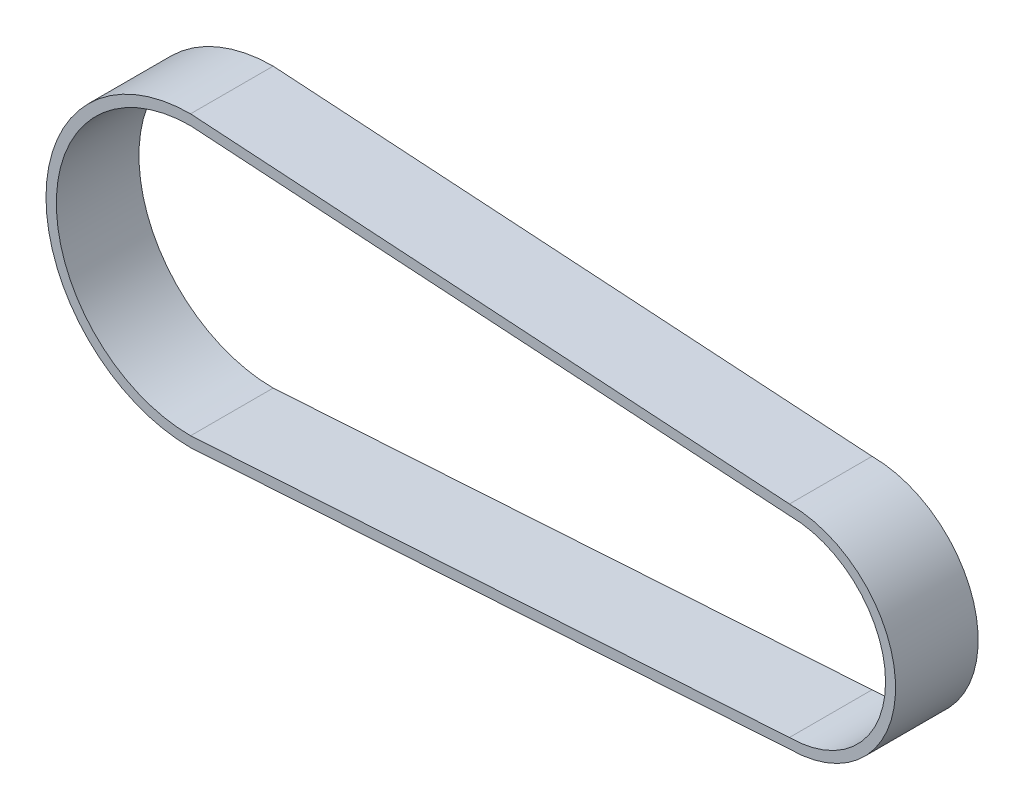
ISO-10303-21;
HEADER;
FILE_DESCRIPTION(('STEP AP214'),'2;1');
FILE_NAME('part.step','',(''),(''),'','','');
FILE_SCHEMA(('AUTOMOTIVE_DESIGN { 1 0 10303 214 1 1 1 1 }'));
ENDSEC;
DATA;
#1=APPLICATION_CONTEXT('core data for automotive mechanical design processes');
#2=APPLICATION_PROTOCOL_DEFINITION('international standard','automotive_design',2000,#1);
#3=PRODUCT_CONTEXT('',#1,'mechanical');
#4=PRODUCT('Part','Part','',(#3));
#5=PRODUCT_RELATED_PRODUCT_CATEGORY('part','',(#4));
#6=PRODUCT_DEFINITION_FORMATION('','',#4);
#7=PRODUCT_DEFINITION_CONTEXT('part definition',#1,'design');
#8=PRODUCT_DEFINITION('design','',#6,#7);
#9=PRODUCT_DEFINITION_SHAPE('','',#8);
#10=(LENGTH_UNIT() NAMED_UNIT(*) SI_UNIT(.MILLI.,.METRE.));
#11=(NAMED_UNIT(*) PLANE_ANGLE_UNIT() SI_UNIT($,.RADIAN.));
#12=(NAMED_UNIT(*) SI_UNIT($,.STERADIAN.) SOLID_ANGLE_UNIT());
#13=UNCERTAINTY_MEASURE_WITH_UNIT(LENGTH_MEASURE(1.E-05),#10,'distance_accuracy_value','');
#14=(GEOMETRIC_REPRESENTATION_CONTEXT(3) GLOBAL_UNCERTAINTY_ASSIGNED_CONTEXT((#13)) GLOBAL_UNIT_ASSIGNED_CONTEXT((#10,
#11,#12)) REPRESENTATION_CONTEXT('',''));
#15=CARTESIAN_POINT('',(0.,0.,0.));
#16=DIRECTION('',(0.,0.,1.));
#17=DIRECTION('',(1.,0.,0.));
#18=AXIS2_PLACEMENT_3D('',#15,#16,#17);
#19=CARTESIAN_POINT('',(-33.,0.,8.));
#20=DIRECTION('',(0.,0.,1.));
#21=DIRECTION('',(1.,0.,0.));
#22=AXIS2_PLACEMENT_3D('',#19,#20,#21);
#23=PLANE('',#22);
#24=CARTESIAN_POINT('',(-33.,0.,8.));
#25=DIRECTION('',(0.,0.,1.));
#26=DIRECTION('',(1.,0.,0.));
#27=AXIS2_PLACEMENT_3D('',#24,#25,#26);
#28=CIRCLE('',#27,14.);
#29=CARTESIAN_POINT('',(-33.,14.,8.));
#30=VERTEX_POINT('',#29);
#31=CARTESIAN_POINT('',(-33.,-14.,8.));
#32=VERTEX_POINT('',#31);
#33=EDGE_CURVE('E138',#30,#32,#28,.T.);
#34=ORIENTED_EDGE('',*,*,#33,.T.);
#35=DIRECTION('',(0.997945166804636,0.0640737391703274,0.));
#36=VECTOR('',#35,1.);
#37=CARTESIAN_POINT('',(-33.,-14.,8.));
#38=LINE('',#37,#36);
#39=CARTESIAN_POINT('',(25.,-10.2760710753495,8.));
#40=VERTEX_POINT('',#39);
#41=EDGE_CURVE('E141',#32,#40,#38,.T.);
#42=ORIENTED_EDGE('',*,*,#41,.T.);
#43=CARTESIAN_POINT('',(25.,0.,8.));
#44=DIRECTION('',(0.,0.,1.));
#45=DIRECTION('',(1.,0.,0.));
#46=AXIS2_PLACEMENT_3D('',#43,#44,#45);
#47=CIRCLE('',#46,10.2760710753495);
#48=CARTESIAN_POINT('',(25.,10.2760710753495,8.));
#49=VERTEX_POINT('',#48);
#50=EDGE_CURVE('E144',#40,#49,#47,.T.);
#51=ORIENTED_EDGE('',*,*,#50,.T.);
#52=DIRECTION('',(-0.997945166804636,0.0640737391703274,0.));
#53=VECTOR('',#52,1.);
#54=CARTESIAN_POINT('',(25.,10.2760710753495,8.));
#55=LINE('',#54,#53);
#56=EDGE_CURVE('E146',#49,#30,#55,.T.);
#57=ORIENTED_EDGE('',*,*,#56,.T.);
#58=EDGE_LOOP('',(#34,#42,#51,#57));
#59=FACE_BOUND('',#58,.T.);
#60=DIRECTION('',(0.997977728901657,0.0635645547163693,0.));
#61=VECTOR('',#60,1.);
#62=CARTESIAN_POINT('',(-33.,-13.,8.));
#63=LINE('',#62,#61);
#64=CARTESIAN_POINT('',(-33.,-13.,8.));
#65=VERTEX_POINT('',#64);
#66=CARTESIAN_POINT('',(25.,-9.30578512247269,8.));
#67=VERTEX_POINT('',#66);
#68=EDGE_CURVE('E110',#65,#67,#63,.T.);
#69=ORIENTED_EDGE('',*,*,#68,.F.);
#70=CARTESIAN_POINT('',(-33.,0.,8.));
#71=DIRECTION('',(0.,0.,1.));
#72=DIRECTION('',(1.,0.,0.));
#73=AXIS2_PLACEMENT_3D('',#70,#71,#72);
#74=CIRCLE('',#73,13.);
#75=CARTESIAN_POINT('',(-33.,13.,8.));
#76=VERTEX_POINT('',#75);
#77=EDGE_CURVE('E102',#76,#65,#74,.T.);
#78=ORIENTED_EDGE('',*,*,#77,.F.);
#79=DIRECTION('',(-0.997977728901657,0.0635645547163693,0.));
#80=VECTOR('',#79,1.);
#81=CARTESIAN_POINT('',(25.,9.30578512247269,8.));
#82=LINE('',#81,#80);
#83=CARTESIAN_POINT('',(25.,9.30578512247269,8.));
#84=VERTEX_POINT('',#83);
#85=EDGE_CURVE('E124',#84,#76,#82,.T.);
#86=ORIENTED_EDGE('',*,*,#85,.F.);
#87=CARTESIAN_POINT('',(25.,0.,8.));
#88=DIRECTION('',(0.,0.,1.));
#89=DIRECTION('',(-1.,0.,0.));
#90=AXIS2_PLACEMENT_3D('',#87,#88,#89);
#91=CIRCLE('',#90,9.30578512247269);
#92=EDGE_CURVE('E122',#67,#84,#91,.T.);
#93=ORIENTED_EDGE('',*,*,#92,.F.);
#94=EDGE_LOOP('',(#69,#78,#86,#93));
#95=FACE_BOUND('',#94,.T.);
#96=ADVANCED_FACE('F37',(#59,#95),#23,.T.);
#97=CARTESIAN_POINT('',(-33.,0.,0.));
#98=DIRECTION('',(0.,0.,1.));
#99=DIRECTION('',(1.,0.,0.));
#100=AXIS2_PLACEMENT_3D('',#97,#98,#99);
#101=PLANE('',#100);
#102=CARTESIAN_POINT('',(-33.,0.,0.));
#103=DIRECTION('',(0.,0.,1.));
#104=DIRECTION('',(1.,0.,0.));
#105=AXIS2_PLACEMENT_3D('',#102,#103,#104);
#106=CIRCLE('',#105,14.);
#107=CARTESIAN_POINT('',(-33.,14.,0.));
#108=VERTEX_POINT('',#107);
#109=CARTESIAN_POINT('',(-33.,-14.,0.));
#110=VERTEX_POINT('',#109);
#111=EDGE_CURVE('E118',#108,#110,#106,.T.);
#112=ORIENTED_EDGE('',*,*,#111,.F.);
#113=DIRECTION('',(-0.997945166804636,0.0640737391703274,0.));
#114=VECTOR('',#113,1.);
#115=CARTESIAN_POINT('',(25.,10.2760710753495,0.));
#116=LINE('',#115,#114);
#117=CARTESIAN_POINT('',(25.,10.2760710753495,0.));
#118=VERTEX_POINT('',#117);
#119=EDGE_CURVE('E142',#118,#108,#116,.T.);
#120=ORIENTED_EDGE('',*,*,#119,.F.);
#121=CARTESIAN_POINT('',(25.,0.,0.));
#122=DIRECTION('',(0.,0.,1.));
#123=DIRECTION('',(1.,0.,0.));
#124=AXIS2_PLACEMENT_3D('',#121,#122,#123);
#125=CIRCLE('',#124,10.2760710753495);
#126=CARTESIAN_POINT('',(25.,-10.2760710753495,0.));
#127=VERTEX_POINT('',#126);
#128=EDGE_CURVE('E153',#127,#118,#125,.T.);
#129=ORIENTED_EDGE('',*,*,#128,.F.);
#130=DIRECTION('',(0.997945166804636,0.0640737391703274,0.));
#131=VECTOR('',#130,1.);
#132=CARTESIAN_POINT('',(-33.,-14.,0.));
#133=LINE('',#132,#131);
#134=EDGE_CURVE('E151',#110,#127,#133,.T.);
#135=ORIENTED_EDGE('',*,*,#134,.F.);
#136=EDGE_LOOP('',(#112,#120,#129,#135));
#137=FACE_BOUND('',#136,.T.);
#138=CARTESIAN_POINT('',(-33.,0.,0.));
#139=DIRECTION('',(0.,0.,1.));
#140=DIRECTION('',(1.,0.,0.));
#141=AXIS2_PLACEMENT_3D('',#138,#139,#140);
#142=CIRCLE('',#141,13.);
#143=CARTESIAN_POINT('',(-33.,13.,0.));
#144=VERTEX_POINT('',#143);
#145=CARTESIAN_POINT('',(-33.,-13.,0.));
#146=VERTEX_POINT('',#145);
#147=EDGE_CURVE('E60',#144,#146,#142,.T.);
#148=ORIENTED_EDGE('',*,*,#147,.T.);
#149=DIRECTION('',(0.997977728901657,0.0635645547163693,0.));
#150=VECTOR('',#149,1.);
#151=CARTESIAN_POINT('',(-33.,-13.,0.));
#152=LINE('',#151,#150);
#153=CARTESIAN_POINT('',(25.,-9.30578512247269,0.));
#154=VERTEX_POINT('',#153);
#155=EDGE_CURVE('E117',#146,#154,#152,.T.);
#156=ORIENTED_EDGE('',*,*,#155,.T.);
#157=CARTESIAN_POINT('',(25.,0.,0.));
#158=DIRECTION('',(0.,0.,1.));
#159=DIRECTION('',(-1.,0.,0.));
#160=AXIS2_PLACEMENT_3D('',#157,#158,#159);
#161=CIRCLE('',#160,9.30578512247269);
#162=CARTESIAN_POINT('',(25.,9.30578512247269,0.));
#163=VERTEX_POINT('',#162);
#164=EDGE_CURVE('E130',#154,#163,#161,.T.);
#165=ORIENTED_EDGE('',*,*,#164,.T.);
#166=DIRECTION('',(-0.997977728901657,0.0635645547163693,0.));
#167=VECTOR('',#166,1.);
#168=CARTESIAN_POINT('',(25.,9.30578512247269,0.));
#169=LINE('',#168,#167);
#170=EDGE_CURVE('E111',#163,#144,#169,.T.);
#171=ORIENTED_EDGE('',*,*,#170,.T.);
#172=EDGE_LOOP('',(#148,#156,#165,#171));
#173=FACE_BOUND('',#172,.T.);
#174=ADVANCED_FACE('F171',(#137,#173),#101,.F.);
#175=CARTESIAN_POINT('',(-33.,0.,8.));
#176=DIRECTION('',(0.,0.,-1.));
#177=DIRECTION('',(-1.,0.,0.));
#178=AXIS2_PLACEMENT_3D('',#175,#176,#177);
#179=CYLINDRICAL_SURFACE('',#178,14.);
#180=ORIENTED_EDGE('',*,*,#111,.T.);
#181=DIRECTION('',(0.,0.,-1.));
#182=VECTOR('',#181,1.);
#183=CARTESIAN_POINT('',(-33.,-14.,8.));
#184=LINE('',#183,#182);
#185=EDGE_CURVE('E11',#32,#110,#184,.T.);
#186=ORIENTED_EDGE('',*,*,#185,.F.);
#187=ORIENTED_EDGE('',*,*,#33,.F.);
#188=DIRECTION('',(0.,0.,-1.));
#189=VECTOR('',#188,1.);
#190=CARTESIAN_POINT('',(-33.,14.,8.));
#191=LINE('',#190,#189);
#192=EDGE_CURVE('E148',#30,#108,#191,.T.);
#193=ORIENTED_EDGE('',*,*,#192,.T.);
#194=EDGE_LOOP('',(#180,#186,#187,#193));
#195=FACE_BOUND('',#194,.T.);
#196=ADVANCED_FACE('F39',(#195),#179,.T.);
#197=CARTESIAN_POINT('',(-33.,-14.,8.));
#198=DIRECTION('',(-0.0640737391703273,0.997945166804636,0.));
#199=DIRECTION('',(-0.997945166804636,-0.0640737391703274,0.));
#200=AXIS2_PLACEMENT_3D('',#197,#198,#199);
#201=PLANE('',#200);
#202=ORIENTED_EDGE('',*,*,#134,.T.);
#203=DIRECTION('',(0.,0.,-1.));
#204=VECTOR('',#203,1.);
#205=CARTESIAN_POINT('',(25.,-10.2760710753495,8.));
#206=LINE('',#205,#204);
#207=EDGE_CURVE('E45',#40,#127,#206,.T.);
#208=ORIENTED_EDGE('',*,*,#207,.F.);
#209=ORIENTED_EDGE('',*,*,#41,.F.);
#210=ORIENTED_EDGE('',*,*,#185,.T.);
#211=EDGE_LOOP('',(#202,#208,#209,#210));
#212=FACE_BOUND('',#211,.T.);
#213=ADVANCED_FACE('F181',(#212),#201,.F.);
#214=CARTESIAN_POINT('',(25.,0.,8.));
#215=DIRECTION('',(0.,0.,-1.));
#216=DIRECTION('',(-1.,0.,0.));
#217=AXIS2_PLACEMENT_3D('',#214,#215,#216);
#218=CYLINDRICAL_SURFACE('',#217,10.2760710753495);
#219=ORIENTED_EDGE('',*,*,#128,.T.);
#220=DIRECTION('',(0.,0.,-1.));
#221=VECTOR('',#220,1.);
#222=CARTESIAN_POINT('',(25.,10.2760710753495,8.));
#223=LINE('',#222,#221);
#224=EDGE_CURVE('E158',#49,#118,#223,.T.);
#225=ORIENTED_EDGE('',*,*,#224,.F.);
#226=ORIENTED_EDGE('',*,*,#50,.F.);
#227=ORIENTED_EDGE('',*,*,#207,.T.);
#228=EDGE_LOOP('',(#219,#225,#226,#227));
#229=FACE_BOUND('',#228,.T.);
#230=ADVANCED_FACE('F165',(#229),#218,.T.);
#231=CARTESIAN_POINT('',(25.,10.2760710753495,8.));
#232=DIRECTION('',(-0.0640737391703273,-0.997945166804636,0.));
#233=DIRECTION('',(0.997945166804636,-0.0640737391703274,0.));
#234=AXIS2_PLACEMENT_3D('',#231,#232,#233);
#235=PLANE('',#234);
#236=ORIENTED_EDGE('',*,*,#119,.T.);
#237=ORIENTED_EDGE('',*,*,#192,.F.);
#238=ORIENTED_EDGE('',*,*,#56,.F.);
#239=ORIENTED_EDGE('',*,*,#224,.T.);
#240=EDGE_LOOP('',(#236,#237,#238,#239));
#241=FACE_BOUND('',#240,.T.);
#242=ADVANCED_FACE('F175',(#241),#235,.F.);
#243=CARTESIAN_POINT('',(-33.,0.,8.));
#244=DIRECTION('',(0.,0.,-1.));
#245=DIRECTION('',(-1.,0.,0.));
#246=AXIS2_PLACEMENT_3D('',#243,#244,#245);
#247=CYLINDRICAL_SURFACE('',#246,13.);
#248=ORIENTED_EDGE('',*,*,#147,.F.);
#249=DIRECTION('',(0.,0.,-1.));
#250=VECTOR('',#249,1.);
#251=CARTESIAN_POINT('',(-33.,13.,8.));
#252=LINE('',#251,#250);
#253=EDGE_CURVE('E106',#76,#144,#252,.T.);
#254=ORIENTED_EDGE('',*,*,#253,.F.);
#255=ORIENTED_EDGE('',*,*,#77,.T.);
#256=DIRECTION('',(0.,0.,-1.));
#257=VECTOR('',#256,1.);
#258=CARTESIAN_POINT('',(-33.,-13.,8.));
#259=LINE('',#258,#257);
#260=EDGE_CURVE('E105',#65,#146,#259,.T.);
#261=ORIENTED_EDGE('',*,*,#260,.T.);
#262=EDGE_LOOP('',(#248,#254,#255,#261));
#263=FACE_BOUND('',#262,.T.);
#264=ADVANCED_FACE('F104',(#263),#247,.F.);
#265=CARTESIAN_POINT('',(-33.,-13.,8.));
#266=DIRECTION('',(-0.0635645547163693,0.997977728901657,0.));
#267=DIRECTION('',(-0.997977728901657,-0.0635645547163693,0.));
#268=AXIS2_PLACEMENT_3D('',#265,#266,#267);
#269=PLANE('',#268);
#270=ORIENTED_EDGE('',*,*,#155,.F.);
#271=ORIENTED_EDGE('',*,*,#260,.F.);
#272=ORIENTED_EDGE('',*,*,#68,.T.);
#273=DIRECTION('',(0.,0.,-1.));
#274=VECTOR('',#273,1.);
#275=CARTESIAN_POINT('',(25.,-9.30578512247269,8.));
#276=LINE('',#275,#274);
#277=EDGE_CURVE('E119',#67,#154,#276,.T.);
#278=ORIENTED_EDGE('',*,*,#277,.T.);
#279=EDGE_LOOP('',(#270,#271,#272,#278));
#280=FACE_BOUND('',#279,.T.);
#281=ADVANCED_FACE('F114',(#280),#269,.T.);
#282=CARTESIAN_POINT('',(25.,0.,8.));
#283=DIRECTION('',(0.,0.,-1.));
#284=DIRECTION('',(-1.,0.,0.));
#285=AXIS2_PLACEMENT_3D('',#282,#283,#284);
#286=CYLINDRICAL_SURFACE('',#285,9.30578512247269);
#287=ORIENTED_EDGE('',*,*,#164,.F.);
#288=ORIENTED_EDGE('',*,*,#277,.F.);
#289=ORIENTED_EDGE('',*,*,#92,.T.);
#290=DIRECTION('',(0.,0.,-1.));
#291=VECTOR('',#290,1.);
#292=CARTESIAN_POINT('',(25.,9.30578512247269,8.));
#293=LINE('',#292,#291);
#294=EDGE_CURVE('E52',#84,#163,#293,.T.);
#295=ORIENTED_EDGE('',*,*,#294,.T.);
#296=EDGE_LOOP('',(#287,#288,#289,#295));
#297=FACE_BOUND('',#296,.T.);
#298=ADVANCED_FACE('F204',(#297),#286,.F.);
#299=CARTESIAN_POINT('',(25.,9.30578512247269,8.));
#300=DIRECTION('',(-0.0635645547163693,-0.997977728901657,0.));
#301=DIRECTION('',(0.997977728901657,-0.0635645547163693,0.));
#302=AXIS2_PLACEMENT_3D('',#299,#300,#301);
#303=PLANE('',#302);
#304=ORIENTED_EDGE('',*,*,#170,.F.);
#305=ORIENTED_EDGE('',*,*,#294,.F.);
#306=ORIENTED_EDGE('',*,*,#85,.T.);
#307=ORIENTED_EDGE('',*,*,#253,.T.);
#308=EDGE_LOOP('',(#304,#305,#306,#307));
#309=FACE_BOUND('',#308,.T.);
#310=ADVANCED_FACE('F208',(#309),#303,.T.);
#311=CLOSED_SHELL('',(#96,#174,#196,#213,#230,#242,#264,#281,#298,#310));
#312=MANIFOLD_SOLID_BREP('B2',#311);
#313=ADVANCED_BREP_SHAPE_REPRESENTATION('',(#18,#312),#14);
#314=SHAPE_DEFINITION_REPRESENTATION(#9,#313);
ENDSEC;
END-ISO-10303-21;
